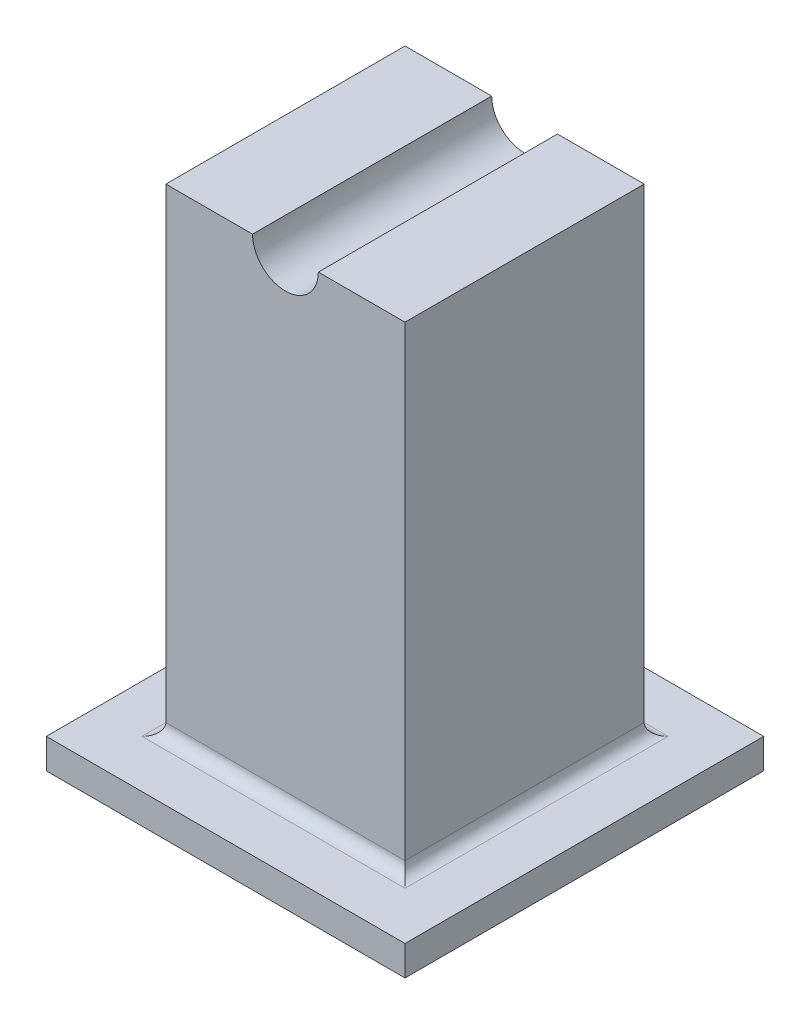
ISO-10303-21;
HEADER;
FILE_DESCRIPTION(('STEP AP214'),'2;1');
FILE_NAME('part.step','',(''),(''),'','','');
FILE_SCHEMA(('AUTOMOTIVE_DESIGN { 1 0 10303 214 1 1 1 1 }'));
ENDSEC;
DATA;
#1=APPLICATION_CONTEXT('core data for automotive mechanical design processes');
#2=APPLICATION_PROTOCOL_DEFINITION('international standard','automotive_design',2000,#1);
#3=PRODUCT_CONTEXT('',#1,'mechanical');
#4=PRODUCT('Part','Part','',(#3));
#5=PRODUCT_RELATED_PRODUCT_CATEGORY('part','',(#4));
#6=PRODUCT_DEFINITION_FORMATION('','',#4);
#7=PRODUCT_DEFINITION_CONTEXT('part definition',#1,'design');
#8=PRODUCT_DEFINITION('design','',#6,#7);
#9=PRODUCT_DEFINITION_SHAPE('','',#8);
#10=(LENGTH_UNIT() NAMED_UNIT(*) SI_UNIT(.MILLI.,.METRE.));
#11=(NAMED_UNIT(*) PLANE_ANGLE_UNIT() SI_UNIT($,.RADIAN.));
#12=(NAMED_UNIT(*) SI_UNIT($,.STERADIAN.) SOLID_ANGLE_UNIT());
#13=UNCERTAINTY_MEASURE_WITH_UNIT(LENGTH_MEASURE(1.E-05),#10,'distance_accuracy_value','');
#14=(GEOMETRIC_REPRESENTATION_CONTEXT(3) GLOBAL_UNCERTAINTY_ASSIGNED_CONTEXT((#13)) GLOBAL_UNIT_ASSIGNED_CONTEXT((#10,
#11,#12)) REPRESENTATION_CONTEXT('',''));
#15=CARTESIAN_POINT('',(0.,0.,0.));
#16=DIRECTION('',(0.,0.,1.));
#17=DIRECTION('',(1.,0.,0.));
#18=AXIS2_PLACEMENT_3D('',#15,#16,#17);
#19=CARTESIAN_POINT('',(0.,0.,50.8));
#20=DIRECTION('',(0.,1.,0.));
#21=DIRECTION('',(0.,0.,1.));
#22=AXIS2_PLACEMENT_3D('',#19,#20,#21);
#23=PLANE('',#22);
#24=DIRECTION('',(-1.,0.,0.));
#25=VECTOR('',#24,1.);
#26=CARTESIAN_POINT('',(6.35,0.,44.45));
#27=LINE('',#26,#25);
#28=CARTESIAN_POINT('',(44.45,0.,44.45));
#29=VERTEX_POINT('',#28);
#30=CARTESIAN_POINT('',(6.35,0.,44.45));
#31=VERTEX_POINT('',#30);
#32=EDGE_CURVE('E209',#29,#31,#27,.T.);
#33=ORIENTED_EDGE('',*,*,#32,.F.);
#34=DIRECTION('',(0.,0.,1.));
#35=VECTOR('',#34,1.);
#36=CARTESIAN_POINT('',(44.45,0.,6.35));
#37=LINE('',#36,#35);
#38=CARTESIAN_POINT('',(44.45,0.,6.35));
#39=VERTEX_POINT('',#38);
#40=EDGE_CURVE('E190',#39,#29,#37,.T.);
#41=ORIENTED_EDGE('',*,*,#40,.F.);
#42=DIRECTION('',(1.,0.,0.));
#43=VECTOR('',#42,1.);
#44=CARTESIAN_POINT('',(6.35,0.,6.35));
#45=LINE('',#44,#43);
#46=CARTESIAN_POINT('',(6.35,0.,6.35));
#47=VERTEX_POINT('',#46);
#48=EDGE_CURVE('E198',#47,#39,#45,.T.);
#49=ORIENTED_EDGE('',*,*,#48,.F.);
#50=DIRECTION('',(0.,0.,-1.));
#51=VECTOR('',#50,1.);
#52=CARTESIAN_POINT('',(6.35,0.,6.35));
#53=LINE('',#52,#51);
#54=EDGE_CURVE('E212',#31,#47,#53,.T.);
#55=ORIENTED_EDGE('',*,*,#54,.F.);
#56=EDGE_LOOP('',(#33,#41,#49,#55));
#57=FACE_BOUND('',#56,.T.);
#58=DIRECTION('',(0.,0.,-1.));
#59=VECTOR('',#58,1.);
#60=CARTESIAN_POINT('',(-12.7,0.,63.5));
#61=LINE('',#60,#59);
#62=CARTESIAN_POINT('',(-12.7,0.,63.5));
#63=VERTEX_POINT('',#62);
#64=CARTESIAN_POINT('',(-12.7,0.,-12.7));
#65=VERTEX_POINT('',#64);
#66=EDGE_CURVE('E184',#63,#65,#61,.T.);
#67=ORIENTED_EDGE('',*,*,#66,.T.);
#68=DIRECTION('',(1.,0.,0.));
#69=VECTOR('',#68,1.);
#70=CARTESIAN_POINT('',(63.5,0.,-12.7));
#71=LINE('',#70,#69);
#72=CARTESIAN_POINT('',(63.5,0.,-12.7));
#73=VERTEX_POINT('',#72);
#74=EDGE_CURVE('E156',#65,#73,#71,.T.);
#75=ORIENTED_EDGE('',*,*,#74,.T.);
#76=DIRECTION('',(0.,0.,1.));
#77=VECTOR('',#76,1.);
#78=CARTESIAN_POINT('',(63.5,0.,63.5));
#79=LINE('',#78,#77);
#80=CARTESIAN_POINT('',(63.5,0.,63.5));
#81=VERTEX_POINT('',#80);
#82=EDGE_CURVE('E179',#73,#81,#79,.T.);
#83=ORIENTED_EDGE('',*,*,#82,.T.);
#84=DIRECTION('',(-1.,0.,0.));
#85=VECTOR('',#84,1.);
#86=CARTESIAN_POINT('',(63.5,0.,63.5));
#87=LINE('',#86,#85);
#88=EDGE_CURVE('E176',#81,#63,#87,.T.);
#89=ORIENTED_EDGE('',*,*,#88,.T.);
#90=EDGE_LOOP('',(#67,#75,#83,#89));
#91=FACE_BOUND('',#90,.T.);
#92=ADVANCED_FACE('F37',(#57,#91),#23,.F.);
#93=CARTESIAN_POINT('',(44.45,95.25,6.35));
#94=DIRECTION('',(1.,0.,0.));
#95=DIRECTION('',(0.,0.,-1.));
#96=AXIS2_PLACEMENT_3D('',#93,#94,#95);
#97=PLANE('',#96);
#98=ORIENTED_EDGE('',*,*,#40,.T.);
#99=DIRECTION('',(0.,-1.,0.));
#100=VECTOR('',#99,1.);
#101=CARTESIAN_POINT('',(44.45,95.25,44.45));
#102=LINE('',#101,#100);
#103=CARTESIAN_POINT('',(44.45,95.25,44.45));
#104=VERTEX_POINT('',#103);
#105=EDGE_CURVE('E207',#104,#29,#102,.T.);
#106=ORIENTED_EDGE('',*,*,#105,.F.);
#107=DIRECTION('',(0.,0.,1.));
#108=VECTOR('',#107,1.);
#109=CARTESIAN_POINT('',(44.45,95.25,6.35));
#110=LINE('',#109,#108);
#111=CARTESIAN_POINT('',(44.45,95.25,6.35));
#112=VERTEX_POINT('',#111);
#113=EDGE_CURVE('E194',#112,#104,#110,.T.);
#114=ORIENTED_EDGE('',*,*,#113,.F.);
#115=DIRECTION('',(0.,-1.,0.));
#116=VECTOR('',#115,1.);
#117=CARTESIAN_POINT('',(44.45,95.25,6.35));
#118=LINE('',#117,#116);
#119=EDGE_CURVE('E217',#112,#39,#118,.T.);
#120=ORIENTED_EDGE('',*,*,#119,.T.);
#121=EDGE_LOOP('',(#98,#106,#114,#120));
#122=FACE_BOUND('',#121,.T.);
#123=ADVANCED_FACE('F319',(#122),#97,.F.);
#124=CARTESIAN_POINT('',(6.35,95.25,6.35));
#125=DIRECTION('',(0.,0.,-1.));
#126=DIRECTION('',(-1.,0.,0.));
#127=AXIS2_PLACEMENT_3D('',#124,#125,#126);
#128=PLANE('',#127);
#129=ORIENTED_EDGE('',*,*,#48,.T.);
#130=ORIENTED_EDGE('',*,*,#119,.F.);
#131=DIRECTION('',(1.,0.,0.));
#132=VECTOR('',#131,1.);
#133=CARTESIAN_POINT('',(6.35,95.25,6.35));
#134=LINE('',#133,#132);
#135=CARTESIAN_POINT('',(6.35,95.25,6.35));
#136=VERTEX_POINT('',#135);
#137=EDGE_CURVE('E204',#136,#112,#134,.T.);
#138=ORIENTED_EDGE('',*,*,#137,.F.);
#139=DIRECTION('',(0.,-1.,0.));
#140=VECTOR('',#139,1.);
#141=CARTESIAN_POINT('',(6.35,95.25,6.35));
#142=LINE('',#141,#140);
#143=EDGE_CURVE('E220',#136,#47,#142,.T.);
#144=ORIENTED_EDGE('',*,*,#143,.T.);
#145=EDGE_LOOP('',(#129,#130,#138,#144));
#146=FACE_BOUND('',#145,.T.);
#147=ADVANCED_FACE('F325',(#146),#128,.F.);
#148=CARTESIAN_POINT('',(6.35,95.25,6.35));
#149=DIRECTION('',(-1.,0.,0.));
#150=DIRECTION('',(0.,0.,1.));
#151=AXIS2_PLACEMENT_3D('',#148,#149,#150);
#152=PLANE('',#151);
#153=ORIENTED_EDGE('',*,*,#54,.T.);
#154=ORIENTED_EDGE('',*,*,#143,.F.);
#155=DIRECTION('',(0.,0.,-1.));
#156=VECTOR('',#155,1.);
#157=CARTESIAN_POINT('',(6.35,95.25,6.35));
#158=LINE('',#157,#156);
#159=CARTESIAN_POINT('',(6.35,95.25,44.45));
#160=VERTEX_POINT('',#159);
#161=EDGE_CURVE('E201',#160,#136,#158,.T.);
#162=ORIENTED_EDGE('',*,*,#161,.F.);
#163=DIRECTION('',(0.,-1.,0.));
#164=VECTOR('',#163,1.);
#165=CARTESIAN_POINT('',(6.35,95.25,44.45));
#166=LINE('',#165,#164);
#167=EDGE_CURVE('E222',#160,#31,#166,.T.);
#168=ORIENTED_EDGE('',*,*,#167,.T.);
#169=EDGE_LOOP('',(#153,#154,#162,#168));
#170=FACE_BOUND('',#169,.T.);
#171=ADVANCED_FACE('F411',(#170),#152,.F.);
#172=CARTESIAN_POINT('',(6.35,95.25,44.45));
#173=DIRECTION('',(0.,0.,1.));
#174=DIRECTION('',(1.,0.,0.));
#175=AXIS2_PLACEMENT_3D('',#172,#173,#174);
#176=PLANE('',#175);
#177=ORIENTED_EDGE('',*,*,#32,.T.);
#178=ORIENTED_EDGE('',*,*,#167,.F.);
#179=DIRECTION('',(-1.,0.,0.));
#180=VECTOR('',#179,1.);
#181=CARTESIAN_POINT('',(6.35,95.25,44.45));
#182=LINE('',#181,#180);
#183=EDGE_CURVE('E197',#104,#160,#182,.T.);
#184=ORIENTED_EDGE('',*,*,#183,.F.);
#185=ORIENTED_EDGE('',*,*,#105,.T.);
#186=EDGE_LOOP('',(#177,#178,#184,#185));
#187=FACE_BOUND('',#186,.T.);
#188=ADVANCED_FACE('F420',(#187),#176,.F.);
#189=CARTESIAN_POINT('',(0.,95.25,0.));
#190=DIRECTION('',(0.,1.,0.));
#191=DIRECTION('',(0.,0.,1.));
#192=AXIS2_PLACEMENT_3D('',#189,#190,#191);
#193=PLANE('',#192);
#194=ORIENTED_EDGE('',*,*,#113,.T.);
#195=ORIENTED_EDGE('',*,*,#183,.T.);
#196=ORIENTED_EDGE('',*,*,#161,.T.);
#197=ORIENTED_EDGE('',*,*,#137,.T.);
#198=EDGE_LOOP('',(#194,#195,#196,#197));
#199=FACE_BOUND('',#198,.T.);
#200=ADVANCED_FACE('F429',(#199),#193,.F.);
#201=CARTESIAN_POINT('',(-12.7,6.35,63.5));
#202=DIRECTION('',(-1.,0.,0.));
#203=DIRECTION('',(0.,0.,1.));
#204=AXIS2_PLACEMENT_3D('',#201,#202,#203);
#205=PLANE('',#204);
#206=ORIENTED_EDGE('',*,*,#66,.F.);
#207=DIRECTION('',(0.,-1.,0.));
#208=VECTOR('',#207,1.);
#209=CARTESIAN_POINT('',(-12.7,6.35,63.5));
#210=LINE('',#209,#208);
#211=CARTESIAN_POINT('',(-12.7,6.35,63.5));
#212=VERTEX_POINT('',#211);
#213=EDGE_CURVE('E175',#212,#63,#210,.T.);
#214=ORIENTED_EDGE('',*,*,#213,.F.);
#215=DIRECTION('',(0.,0.,-1.));
#216=VECTOR('',#215,1.);
#217=CARTESIAN_POINT('',(-12.7,6.35,63.5));
#218=LINE('',#217,#216);
#219=CARTESIAN_POINT('',(-12.7,6.35,-12.7));
#220=VERTEX_POINT('',#219);
#221=EDGE_CURVE('E169',#212,#220,#218,.T.);
#222=ORIENTED_EDGE('',*,*,#221,.T.);
#223=DIRECTION('',(0.,-1.,0.));
#224=VECTOR('',#223,1.);
#225=CARTESIAN_POINT('',(-12.7,6.35,-12.7));
#226=LINE('',#225,#224);
#227=EDGE_CURVE('E151',#220,#65,#226,.T.);
#228=ORIENTED_EDGE('',*,*,#227,.T.);
#229=EDGE_LOOP('',(#206,#214,#222,#228));
#230=FACE_BOUND('',#229,.T.);
#231=ADVANCED_FACE('F174',(#230),#205,.T.);
#232=CARTESIAN_POINT('',(63.5,6.35,63.5));
#233=DIRECTION('',(0.,0.,1.));
#234=DIRECTION('',(1.,0.,0.));
#235=AXIS2_PLACEMENT_3D('',#232,#233,#234);
#236=PLANE('',#235);
#237=ORIENTED_EDGE('',*,*,#88,.F.);
#238=DIRECTION('',(0.,-1.,0.));
#239=VECTOR('',#238,1.);
#240=CARTESIAN_POINT('',(63.5,6.35,63.5));
#241=LINE('',#240,#239);
#242=CARTESIAN_POINT('',(63.5,6.35,63.5));
#243=VERTEX_POINT('',#242);
#244=EDGE_CURVE('E191',#243,#81,#241,.T.);
#245=ORIENTED_EDGE('',*,*,#244,.F.);
#246=DIRECTION('',(-1.,0.,0.));
#247=VECTOR('',#246,1.);
#248=CARTESIAN_POINT('',(63.5,6.35,63.5));
#249=LINE('',#248,#247);
#250=EDGE_CURVE('E162',#243,#212,#249,.T.);
#251=ORIENTED_EDGE('',*,*,#250,.T.);
#252=ORIENTED_EDGE('',*,*,#213,.T.);
#253=EDGE_LOOP('',(#237,#245,#251,#252));
#254=FACE_BOUND('',#253,.T.);
#255=ADVANCED_FACE('F452',(#254),#236,.T.);
#256=CARTESIAN_POINT('',(63.5,6.35,63.5));
#257=DIRECTION('',(1.,0.,0.));
#258=DIRECTION('',(0.,0.,-1.));
#259=AXIS2_PLACEMENT_3D('',#256,#257,#258);
#260=PLANE('',#259);
#261=ORIENTED_EDGE('',*,*,#82,.F.);
#262=DIRECTION('',(0.,-1.,0.));
#263=VECTOR('',#262,1.);
#264=CARTESIAN_POINT('',(63.5,6.35,-12.7));
#265=LINE('',#264,#263);
#266=CARTESIAN_POINT('',(63.5,6.35,-12.7));
#267=VERTEX_POINT('',#266);
#268=EDGE_CURVE('E161',#267,#73,#265,.T.);
#269=ORIENTED_EDGE('',*,*,#268,.F.);
#270=DIRECTION('',(0.,0.,1.));
#271=VECTOR('',#270,1.);
#272=CARTESIAN_POINT('',(63.5,6.35,63.5));
#273=LINE('',#272,#271);
#274=EDGE_CURVE('E172',#267,#243,#273,.T.);
#275=ORIENTED_EDGE('',*,*,#274,.T.);
#276=ORIENTED_EDGE('',*,*,#244,.T.);
#277=EDGE_LOOP('',(#261,#269,#275,#276));
#278=FACE_BOUND('',#277,.T.);
#279=ADVANCED_FACE('F315',(#278),#260,.T.);
#280=CARTESIAN_POINT('',(63.5,6.35,-12.7));
#281=DIRECTION('',(0.,0.,-1.));
#282=DIRECTION('',(-1.,0.,0.));
#283=AXIS2_PLACEMENT_3D('',#280,#281,#282);
#284=PLANE('',#283);
#285=ORIENTED_EDGE('',*,*,#74,.F.);
#286=ORIENTED_EDGE('',*,*,#227,.F.);
#287=DIRECTION('',(1.,0.,0.));
#288=VECTOR('',#287,1.);
#289=CARTESIAN_POINT('',(63.5,6.35,-12.7));
#290=LINE('',#289,#288);
#291=EDGE_CURVE('E154',#220,#267,#290,.T.);
#292=ORIENTED_EDGE('',*,*,#291,.T.);
#293=ORIENTED_EDGE('',*,*,#268,.T.);
#294=EDGE_LOOP('',(#285,#286,#292,#293));
#295=FACE_BOUND('',#294,.T.);
#296=ADVANCED_FACE('F153',(#295),#284,.T.);
#297=CARTESIAN_POINT('',(0.,6.35,0.));
#298=DIRECTION('',(0.,1.,0.));
#299=DIRECTION('',(0.,0.,1.));
#300=AXIS2_PLACEMENT_3D('',#297,#298,#299);
#301=PLANE('',#300);
#302=DIRECTION('',(0.,0.,-1.));
#303=VECTOR('',#302,1.);
#304=CARTESIAN_POINT('',(-2.54,6.35,0.));
#305=LINE('',#304,#303);
#306=CARTESIAN_POINT('',(-2.54,6.35,53.34));
#307=VERTEX_POINT('',#306);
#308=CARTESIAN_POINT('',(-2.54,6.35,-2.54));
#309=VERTEX_POINT('',#308);
#310=EDGE_CURVE('E257',#307,#309,#305,.T.);
#311=ORIENTED_EDGE('',*,*,#310,.T.);
#312=DIRECTION('',(1.,0.,0.));
#313=VECTOR('',#312,1.);
#314=CARTESIAN_POINT('',(0.,6.35,-2.54));
#315=LINE('',#314,#313);
#316=CARTESIAN_POINT('',(53.34,6.35,-2.54));
#317=VERTEX_POINT('',#316);
#318=EDGE_CURVE('E263',#309,#317,#315,.T.);
#319=ORIENTED_EDGE('',*,*,#318,.T.);
#320=DIRECTION('',(0.,0.,1.));
#321=VECTOR('',#320,1.);
#322=CARTESIAN_POINT('',(53.34,6.35,0.));
#323=LINE('',#322,#321);
#324=CARTESIAN_POINT('',(53.34,6.35,53.34));
#325=VERTEX_POINT('',#324);
#326=EDGE_CURVE('E261',#317,#325,#323,.T.);
#327=ORIENTED_EDGE('',*,*,#326,.T.);
#328=DIRECTION('',(-1.,0.,0.));
#329=VECTOR('',#328,1.);
#330=CARTESIAN_POINT('',(0.,6.35,53.34));
#331=LINE('',#330,#329);
#332=EDGE_CURVE('E259',#325,#307,#331,.T.);
#333=ORIENTED_EDGE('',*,*,#332,.T.);
#334=EDGE_LOOP('',(#311,#319,#327,#333));
#335=FACE_BOUND('',#334,.T.);
#336=ORIENTED_EDGE('',*,*,#221,.F.);
#337=ORIENTED_EDGE('',*,*,#250,.F.);
#338=ORIENTED_EDGE('',*,*,#274,.F.);
#339=ORIENTED_EDGE('',*,*,#291,.F.);
#340=EDGE_LOOP('',(#336,#337,#338,#339));
#341=FACE_BOUND('',#340,.T.);
#342=ADVANCED_FACE('F167',(#335,#341),#301,.T.);
#343=CARTESIAN_POINT('',(32.385,107.95,50.8));
#344=DIRECTION('',(0.,-1.,0.));
#345=DIRECTION('',(0.,0.,-1.));
#346=AXIS2_PLACEMENT_3D('',#343,#344,#345);
#347=PLANE('',#346);
#348=DIRECTION('',(-1.,0.,0.));
#349=VECTOR('',#348,1.);
#350=CARTESIAN_POINT('',(32.385,107.95,0.));
#351=LINE('',#350,#349);
#352=CARTESIAN_POINT('',(50.8,107.95,0.));
#353=VERTEX_POINT('',#352);
#354=CARTESIAN_POINT('',(32.385,107.95,0.));
#355=VERTEX_POINT('',#354);
#356=EDGE_CURVE('E241',#353,#355,#351,.T.);
#357=ORIENTED_EDGE('',*,*,#356,.T.);
#358=DIRECTION('',(0.,0.,-1.));
#359=VECTOR('',#358,1.);
#360=CARTESIAN_POINT('',(32.385,107.95,50.8));
#361=LINE('',#360,#359);
#362=CARTESIAN_POINT('',(32.385,107.95,50.8));
#363=VERTEX_POINT('',#362);
#364=EDGE_CURVE('E251',#363,#355,#361,.T.);
#365=ORIENTED_EDGE('',*,*,#364,.F.);
#366=DIRECTION('',(-1.,0.,0.));
#367=VECTOR('',#366,1.);
#368=CARTESIAN_POINT('',(32.385,107.95,50.8));
#369=LINE('',#368,#367);
#370=CARTESIAN_POINT('',(50.8,107.95,50.8));
#371=VERTEX_POINT('',#370);
#372=EDGE_CURVE('E231',#371,#363,#369,.T.);
#373=ORIENTED_EDGE('',*,*,#372,.F.);
#374=DIRECTION('',(0.,0.,-1.));
#375=VECTOR('',#374,1.);
#376=CARTESIAN_POINT('',(50.8,107.95,50.8));
#377=LINE('',#376,#375);
#378=EDGE_CURVE('E254',#371,#353,#377,.T.);
#379=ORIENTED_EDGE('',*,*,#378,.T.);
#380=EDGE_LOOP('',(#357,#365,#373,#379));
#381=FACE_BOUND('',#380,.T.);
#382=ADVANCED_FACE('F306',(#381),#347,.F.);
#383=CARTESIAN_POINT('',(25.4,107.95,50.8));
#384=DIRECTION('',(0.,0.,-1.));
#385=DIRECTION('',(-1.,0.,0.));
#386=AXIS2_PLACEMENT_3D('',#383,#384,#385);
#387=CYLINDRICAL_SURFACE('',#386,6.985);
#388=CARTESIAN_POINT('',(25.4,107.95,0.));
#389=DIRECTION('',(0.,0.,-1.));
#390=DIRECTION('',(1.,0.,0.));
#391=AXIS2_PLACEMENT_3D('',#388,#389,#390);
#392=CIRCLE('',#391,6.985);
#393=CARTESIAN_POINT('',(18.415,107.95,0.));
#394=VERTEX_POINT('',#393);
#395=EDGE_CURVE('E243',#355,#394,#392,.T.);
#396=ORIENTED_EDGE('',*,*,#395,.T.);
#397=DIRECTION('',(0.,0.,-1.));
#398=VECTOR('',#397,1.);
#399=CARTESIAN_POINT('',(18.415,107.95,50.8));
#400=LINE('',#399,#398);
#401=CARTESIAN_POINT('',(18.415,107.95,50.8));
#402=VERTEX_POINT('',#401);
#403=EDGE_CURVE('E248',#402,#394,#400,.T.);
#404=ORIENTED_EDGE('',*,*,#403,.F.);
#405=CARTESIAN_POINT('',(25.4,107.95,50.8));
#406=DIRECTION('',(0.,0.,-1.));
#407=DIRECTION('',(1.,0.,0.));
#408=AXIS2_PLACEMENT_3D('',#405,#406,#407);
#409=CIRCLE('',#408,6.985);
#410=EDGE_CURVE('E233',#363,#402,#409,.T.);
#411=ORIENTED_EDGE('',*,*,#410,.F.);
#412=ORIENTED_EDGE('',*,*,#364,.T.);
#413=EDGE_LOOP('',(#396,#404,#411,#412));
#414=FACE_BOUND('',#413,.T.);
#415=ADVANCED_FACE('F312',(#414),#387,.F.);
#416=CARTESIAN_POINT('',(0.,107.95,50.8));
#417=DIRECTION('',(0.,-1.,0.));
#418=DIRECTION('',(0.,0.,-1.));
#419=AXIS2_PLACEMENT_3D('',#416,#417,#418);
#420=PLANE('',#419);
#421=DIRECTION('',(-1.,0.,0.));
#422=VECTOR('',#421,1.);
#423=CARTESIAN_POINT('',(0.,107.95,0.));
#424=LINE('',#423,#422);
#425=CARTESIAN_POINT('',(0.,107.95,0.));
#426=VERTEX_POINT('',#425);
#427=EDGE_CURVE('E229',#394,#426,#424,.T.);
#428=ORIENTED_EDGE('',*,*,#427,.T.);
#429=DIRECTION('',(0.,0.,-1.));
#430=VECTOR('',#429,1.);
#431=CARTESIAN_POINT('',(0.,107.95,50.8));
#432=LINE('',#431,#430);
#433=CARTESIAN_POINT('',(0.,107.95,50.8));
#434=VERTEX_POINT('',#433);
#435=EDGE_CURVE('E237',#434,#426,#432,.T.);
#436=ORIENTED_EDGE('',*,*,#435,.F.);
#437=DIRECTION('',(-1.,0.,0.));
#438=VECTOR('',#437,1.);
#439=CARTESIAN_POINT('',(0.,107.95,50.8));
#440=LINE('',#439,#438);
#441=EDGE_CURVE('E235',#402,#434,#440,.T.);
#442=ORIENTED_EDGE('',*,*,#441,.F.);
#443=ORIENTED_EDGE('',*,*,#403,.T.);
#444=EDGE_LOOP('',(#428,#436,#442,#443));
#445=FACE_BOUND('',#444,.T.);
#446=ADVANCED_FACE('F366',(#445),#420,.F.);
#447=CARTESIAN_POINT('',(25.4,107.95,0.));
#448=DIRECTION('',(0.,0.,1.));
#449=DIRECTION('',(1.,0.,0.));
#450=AXIS2_PLACEMENT_3D('',#447,#448,#449);
#451=PLANE('',#450);
#452=DIRECTION('',(0.,1.,0.));
#453=VECTOR('',#452,1.);
#454=CARTESIAN_POINT('',(50.8,0.,0.));
#455=LINE('',#454,#453);
#456=CARTESIAN_POINT('',(50.8,8.89,0.));
#457=VERTEX_POINT('',#456);
#458=EDGE_CURVE('E239',#457,#353,#455,.T.);
#459=ORIENTED_EDGE('',*,*,#458,.F.);
#460=DIRECTION('',(1.,0.,0.));
#461=VECTOR('',#460,1.);
#462=CARTESIAN_POINT('',(25.4,8.89,0.));
#463=LINE('',#462,#461);
#464=CARTESIAN_POINT('',(0.,8.89,0.));
#465=VERTEX_POINT('',#464);
#466=EDGE_CURVE('E266',#457,#465,#463,.F.);
#467=ORIENTED_EDGE('',*,*,#466,.T.);
#468=DIRECTION('',(0.,-1.,0.));
#469=VECTOR('',#468,1.);
#470=CARTESIAN_POINT('',(0.,0.,0.));
#471=LINE('',#470,#469);
#472=EDGE_CURVE('E219',#426,#465,#471,.T.);
#473=ORIENTED_EDGE('',*,*,#472,.F.);
#474=ORIENTED_EDGE('',*,*,#427,.F.);
#475=ORIENTED_EDGE('',*,*,#395,.F.);
#476=ORIENTED_EDGE('',*,*,#356,.F.);
#477=EDGE_LOOP('',(#459,#467,#473,#474,#475,#476));
#478=FACE_BOUND('',#477,.T.);
#479=ADVANCED_FACE('F298',(#478),#451,.F.);
#480=CARTESIAN_POINT('',(25.4,107.95,50.8));
#481=DIRECTION('',(0.,0.,1.));
#482=DIRECTION('',(1.,0.,0.));
#483=AXIS2_PLACEMENT_3D('',#480,#481,#482);
#484=PLANE('',#483);
#485=DIRECTION('',(0.,-1.,0.));
#486=VECTOR('',#485,1.);
#487=CARTESIAN_POINT('',(0.,0.,50.8));
#488=LINE('',#487,#486);
#489=CARTESIAN_POINT('',(0.,8.89,50.8));
#490=VERTEX_POINT('',#489);
#491=EDGE_CURVE('E226',#434,#490,#488,.T.);
#492=ORIENTED_EDGE('',*,*,#491,.T.);
#493=DIRECTION('',(-1.,0.,0.));
#494=VECTOR('',#493,1.);
#495=CARTESIAN_POINT('',(50.8,8.89,50.8));
#496=LINE('',#495,#494);
#497=CARTESIAN_POINT('',(50.8,8.89,50.8));
#498=VERTEX_POINT('',#497);
#499=EDGE_CURVE('E46',#490,#498,#496,.F.);
#500=ORIENTED_EDGE('',*,*,#499,.T.);
#501=DIRECTION('',(0.,1.,0.));
#502=VECTOR('',#501,1.);
#503=CARTESIAN_POINT('',(50.8,0.,50.8));
#504=LINE('',#503,#502);
#505=EDGE_CURVE('E228',#498,#371,#504,.T.);
#506=ORIENTED_EDGE('',*,*,#505,.T.);
#507=ORIENTED_EDGE('',*,*,#372,.T.);
#508=ORIENTED_EDGE('',*,*,#410,.T.);
#509=ORIENTED_EDGE('',*,*,#441,.T.);
#510=EDGE_LOOP('',(#492,#500,#506,#507,#508,#509));
#511=FACE_BOUND('',#510,.T.);
#512=ADVANCED_FACE('F354',(#511),#484,.T.);
#513=CARTESIAN_POINT('',(50.8,0.,50.8));
#514=DIRECTION('',(-1.,0.,0.));
#515=DIRECTION('',(0.,0.,1.));
#516=AXIS2_PLACEMENT_3D('',#513,#514,#515);
#517=PLANE('',#516);
#518=ORIENTED_EDGE('',*,*,#505,.F.);
#519=DIRECTION('',(0.,0.,1.));
#520=VECTOR('',#519,1.);
#521=CARTESIAN_POINT('',(50.8,8.89,50.8));
#522=LINE('',#521,#520);
#523=EDGE_CURVE('E269',#498,#457,#522,.F.);
#524=ORIENTED_EDGE('',*,*,#523,.T.);
#525=ORIENTED_EDGE('',*,*,#458,.T.);
#526=ORIENTED_EDGE('',*,*,#378,.F.);
#527=EDGE_LOOP('',(#518,#524,#525,#526));
#528=FACE_BOUND('',#527,.T.);
#529=ADVANCED_FACE('F293',(#528),#517,.F.);
#530=CARTESIAN_POINT('',(0.,0.,50.8));
#531=DIRECTION('',(1.,0.,0.));
#532=DIRECTION('',(0.,0.,-1.));
#533=AXIS2_PLACEMENT_3D('',#530,#531,#532);
#534=PLANE('',#533);
#535=ORIENTED_EDGE('',*,*,#472,.T.);
#536=DIRECTION('',(0.,0.,-1.));
#537=VECTOR('',#536,1.);
#538=CARTESIAN_POINT('',(0.,8.89,50.8));
#539=LINE('',#538,#537);
#540=EDGE_CURVE('E11',#465,#490,#539,.F.);
#541=ORIENTED_EDGE('',*,*,#540,.T.);
#542=ORIENTED_EDGE('',*,*,#491,.F.);
#543=ORIENTED_EDGE('',*,*,#435,.T.);
#544=EDGE_LOOP('',(#535,#541,#542,#543));
#545=FACE_BOUND('',#544,.T.);
#546=ADVANCED_FACE('F332',(#545),#534,.F.);
#547=CARTESIAN_POINT('',(0.,8.89,53.34));
#548=DIRECTION('',(1.,0.,0.));
#549=DIRECTION('',(0.,0.,-1.));
#550=AXIS2_PLACEMENT_3D('',#547,#548,#549);
#551=CYLINDRICAL_SURFACE('',#550,2.54);
#552=CARTESIAN_POINT('',(53.34,8.89,53.34));
#553=DIRECTION('',(0.707106781186547,0.,-0.707106781186547));
#554=DIRECTION('',(0.707106781186547,0.,0.707106781186547));
#555=AXIS2_PLACEMENT_3D('',#552,#553,#554);
#556=ELLIPSE('',#555,3.59210244842766,2.54);
#557=EDGE_CURVE('E275',#498,#325,#556,.F.);
#558=ORIENTED_EDGE('',*,*,#557,.F.);
#559=ORIENTED_EDGE('',*,*,#499,.F.);
#560=CARTESIAN_POINT('',(-2.54,8.89,53.34));
#561=DIRECTION('',(-0.707106781186547,0.,-0.707106781186547));
#562=DIRECTION('',(0.707106781186547,0.,-0.707106781186547));
#563=AXIS2_PLACEMENT_3D('',#560,#561,#562);
#564=ELLIPSE('',#563,3.59210244842766,2.54);
#565=EDGE_CURVE('E41',#307,#490,#564,.F.);
#566=ORIENTED_EDGE('',*,*,#565,.F.);
#567=ORIENTED_EDGE('',*,*,#332,.F.);
#568=EDGE_LOOP('',(#558,#559,#566,#567));
#569=FACE_BOUND('',#568,.T.);
#570=ADVANCED_FACE('F39',(#569),#551,.F.);
#571=CARTESIAN_POINT('',(-2.54,8.89,0.));
#572=DIRECTION('',(0.,0.,-1.));
#573=DIRECTION('',(-1.,0.,0.));
#574=AXIS2_PLACEMENT_3D('',#571,#572,#573);
#575=CYLINDRICAL_SURFACE('',#574,2.54);
#576=ORIENTED_EDGE('',*,*,#565,.T.);
#577=ORIENTED_EDGE('',*,*,#540,.F.);
#578=CARTESIAN_POINT('',(-2.54,8.89,-2.54));
#579=DIRECTION('',(0.707106781186547,0.,-0.707106781186547));
#580=DIRECTION('',(-0.707106781186547,0.,-0.707106781186547));
#581=AXIS2_PLACEMENT_3D('',#578,#579,#580);
#582=ELLIPSE('',#581,3.59210244842766,2.54);
#583=EDGE_CURVE('E274',#309,#465,#582,.F.);
#584=ORIENTED_EDGE('',*,*,#583,.F.);
#585=ORIENTED_EDGE('',*,*,#310,.F.);
#586=EDGE_LOOP('',(#576,#577,#584,#585));
#587=FACE_BOUND('',#586,.T.);
#588=ADVANCED_FACE('F285',(#587),#575,.F.);
#589=CARTESIAN_POINT('',(53.34,8.89,0.));
#590=DIRECTION('',(0.,0.,1.));
#591=DIRECTION('',(1.,0.,0.));
#592=AXIS2_PLACEMENT_3D('',#589,#590,#591);
#593=CYLINDRICAL_SURFACE('',#592,2.54);
#594=ORIENTED_EDGE('',*,*,#557,.T.);
#595=ORIENTED_EDGE('',*,*,#326,.F.);
#596=CARTESIAN_POINT('',(53.34,8.89,-2.54));
#597=DIRECTION('',(0.707106781186547,0.,0.707106781186547));
#598=DIRECTION('',(-0.707106781186547,0.,0.707106781186547));
#599=AXIS2_PLACEMENT_3D('',#596,#597,#598);
#600=ELLIPSE('',#599,3.59210244842766,2.54);
#601=EDGE_CURVE('E272',#457,#317,#600,.T.);
#602=ORIENTED_EDGE('',*,*,#601,.F.);
#603=ORIENTED_EDGE('',*,*,#523,.F.);
#604=EDGE_LOOP('',(#594,#595,#602,#603));
#605=FACE_BOUND('',#604,.T.);
#606=ADVANCED_FACE('F290',(#605),#593,.F.);
#607=CARTESIAN_POINT('',(0.,8.89,-2.54));
#608=DIRECTION('',(1.,0.,0.));
#609=DIRECTION('',(0.,0.,-1.));
#610=AXIS2_PLACEMENT_3D('',#607,#608,#609);
#611=CYLINDRICAL_SURFACE('',#610,2.54);
#612=ORIENTED_EDGE('',*,*,#583,.T.);
#613=ORIENTED_EDGE('',*,*,#466,.F.);
#614=ORIENTED_EDGE('',*,*,#601,.T.);
#615=ORIENTED_EDGE('',*,*,#318,.F.);
#616=EDGE_LOOP('',(#612,#613,#614,#615));
#617=FACE_BOUND('',#616,.T.);
#618=ADVANCED_FACE('F302',(#617),#611,.F.);
#619=CLOSED_SHELL('',(#92,#123,#147,#171,#188,#200,#231,#255,#279,#296,#342,#382,#415,#446,#479,
#512,#529,#546,#570,#588,#606,#618));
#620=MANIFOLD_SOLID_BREP('B2',#619);
#621=ADVANCED_BREP_SHAPE_REPRESENTATION('',(#18,#620),#14);
#622=SHAPE_DEFINITION_REPRESENTATION(#9,#621);
ENDSEC;
END-ISO-10303-21;
